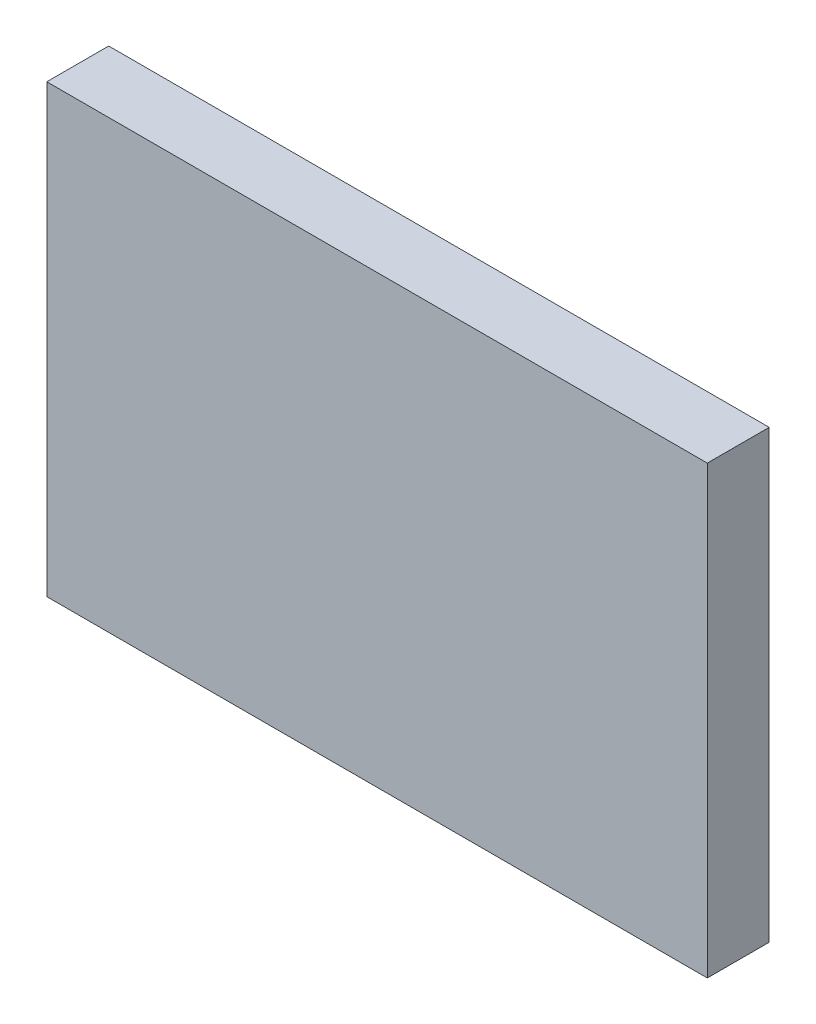
ISO-10303-21;
HEADER;
FILE_DESCRIPTION(('STEP AP214'),'2;1');
FILE_NAME('part.step','',(''),(''),'','','');
FILE_SCHEMA(('AUTOMOTIVE_DESIGN { 1 0 10303 214 1 1 1 1 }'));
ENDSEC;
DATA;
#1=APPLICATION_CONTEXT('core data for automotive mechanical design processes');
#2=APPLICATION_PROTOCOL_DEFINITION('international standard','automotive_design',2000,#1);
#3=PRODUCT_CONTEXT('',#1,'mechanical');
#4=PRODUCT('Part','Part','',(#3));
#5=PRODUCT_RELATED_PRODUCT_CATEGORY('part','',(#4));
#6=PRODUCT_DEFINITION_FORMATION('','',#4);
#7=PRODUCT_DEFINITION_CONTEXT('part definition',#1,'design');
#8=PRODUCT_DEFINITION('design','',#6,#7);
#9=PRODUCT_DEFINITION_SHAPE('','',#8);
#10=(LENGTH_UNIT() NAMED_UNIT(*) SI_UNIT(.MILLI.,.METRE.));
#11=(NAMED_UNIT(*) PLANE_ANGLE_UNIT() SI_UNIT($,.RADIAN.));
#12=(NAMED_UNIT(*) SI_UNIT($,.STERADIAN.) SOLID_ANGLE_UNIT());
#13=UNCERTAINTY_MEASURE_WITH_UNIT(LENGTH_MEASURE(1.E-05),#10,'distance_accuracy_value','');
#14=(GEOMETRIC_REPRESENTATION_CONTEXT(3) GLOBAL_UNCERTAINTY_ASSIGNED_CONTEXT((#13)) GLOBAL_UNIT_ASSIGNED_CONTEXT((#10,
#11,#12)) REPRESENTATION_CONTEXT('',''));
#15=CARTESIAN_POINT('',(0.,0.,0.));
#16=DIRECTION('',(0.,0.,1.));
#17=DIRECTION('',(1.,0.,0.));
#18=AXIS2_PLACEMENT_3D('',#15,#16,#17);
#19=CARTESIAN_POINT('',(0.,-30.7,5.));
#20=DIRECTION('',(0.,1.,0.));
#21=DIRECTION('',(0.,0.,1.));
#22=AXIS2_PLACEMENT_3D('',#19,#20,#21);
#23=PLANE('',#22);
#24=DIRECTION('',(0.,0.,-1.));
#25=VECTOR('',#24,1.);
#26=CARTESIAN_POINT('',(-37.65,-30.7,7.));
#27=LINE('',#26,#25);
#28=CARTESIAN_POINT('',(-37.65,-30.7,5.));
#29=VERTEX_POINT('',#28);
#30=CARTESIAN_POINT('',(-37.65,-30.7,0.));
#31=VERTEX_POINT('',#30);
#32=EDGE_CURVE('E270',#29,#31,#27,.T.);
#33=ORIENTED_EDGE('',*,*,#32,.F.);
#34=DIRECTION('',(1.,0.,0.));
#35=VECTOR('',#34,1.);
#36=CARTESIAN_POINT('',(0.,-30.7,5.));
#37=LINE('',#36,#35);
#38=CARTESIAN_POINT('',(-17.95,-30.7,5.));
#39=VERTEX_POINT('',#38);
#40=EDGE_CURVE('E374',#29,#39,#37,.T.);
#41=ORIENTED_EDGE('',*,*,#40,.T.);
#42=DIRECTION('',(0.,0.,1.));
#43=VECTOR('',#42,1.);
#44=CARTESIAN_POINT('',(-17.95,-30.7,5.));
#45=LINE('',#44,#43);
#46=CARTESIAN_POINT('',(-17.95,-30.7,0.));
#47=VERTEX_POINT('',#46);
#48=EDGE_CURVE('E337',#47,#39,#45,.T.);
#49=ORIENTED_EDGE('',*,*,#48,.F.);
#50=DIRECTION('',(1.,0.,0.));
#51=VECTOR('',#50,1.);
#52=CARTESIAN_POINT('',(0.,-30.7,0.));
#53=LINE('',#52,#51);
#54=EDGE_CURVE('E422',#31,#47,#53,.T.);
#55=ORIENTED_EDGE('',*,*,#54,.F.);
#56=EDGE_LOOP('',(#33,#41,#49,#55));
#57=FACE_BOUND('',#56,.T.);
#58=ADVANCED_FACE('F40',(#57),#23,.T.);
#59=CARTESIAN_POINT('',(0.,0.,5.));
#60=DIRECTION('',(0.,0.,1.));
#61=DIRECTION('',(1.,0.,0.));
#62=AXIS2_PLACEMENT_3D('',#59,#60,#61);
#63=PLANE('',#62);
#64=ORIENTED_EDGE('',*,*,#40,.F.);
#65=DIRECTION('',(0.,1.,0.));
#66=VECTOR('',#65,1.);
#67=CARTESIAN_POINT('',(-37.65,0.,5.));
#68=LINE('',#67,#66);
#69=CARTESIAN_POINT('',(-37.65,-28.2,5.));
#70=VERTEX_POINT('',#69);
#71=EDGE_CURVE('E284',#29,#70,#68,.T.);
#72=ORIENTED_EDGE('',*,*,#71,.T.);
#73=DIRECTION('',(-1.,0.,0.));
#74=VECTOR('',#73,1.);
#75=CARTESIAN_POINT('',(0.,-28.2,5.));
#76=LINE('',#75,#74);
#77=CARTESIAN_POINT('',(-43.45,-28.2,5.));
#78=VERTEX_POINT('',#77);
#79=EDGE_CURVE('E274',#70,#78,#76,.T.);
#80=ORIENTED_EDGE('',*,*,#79,.T.);
#81=DIRECTION('',(0.,-1.,0.));
#82=VECTOR('',#81,1.);
#83=CARTESIAN_POINT('',(-43.45,0.,5.));
#84=LINE('',#83,#82);
#85=CARTESIAN_POINT('',(-43.45,24.,5.));
#86=VERTEX_POINT('',#85);
#87=EDGE_CURVE('E377',#86,#78,#84,.T.);
#88=ORIENTED_EDGE('',*,*,#87,.F.);
#89=DIRECTION('',(-1.,0.,0.));
#90=VECTOR('',#89,1.);
#91=CARTESIAN_POINT('',(0.,24.,5.));
#92=LINE('',#91,#90);
#93=CARTESIAN_POINT('',(-40.25,24.,5.));
#94=VERTEX_POINT('',#93);
#95=EDGE_CURVE('E381',#94,#86,#92,.T.);
#96=ORIENTED_EDGE('',*,*,#95,.F.);
#97=DIRECTION('',(0.,1.,0.));
#98=VECTOR('',#97,1.);
#99=CARTESIAN_POINT('',(-40.25,0.,5.));
#100=LINE('',#99,#98);
#101=CARTESIAN_POINT('',(-40.25,-24.,5.));
#102=VERTEX_POINT('',#101);
#103=EDGE_CURVE('E385',#102,#94,#100,.T.);
#104=ORIENTED_EDGE('',*,*,#103,.F.);
#105=DIRECTION('',(-1.,0.,0.));
#106=VECTOR('',#105,1.);
#107=CARTESIAN_POINT('',(0.,-24.,5.));
#108=LINE('',#107,#106);
#109=CARTESIAN_POINT('',(-17.95,-24.,5.));
#110=VERTEX_POINT('',#109);
#111=EDGE_CURVE('E389',#110,#102,#108,.T.);
#112=ORIENTED_EDGE('',*,*,#111,.F.);
#113=DIRECTION('',(0.,-1.,0.));
#114=VECTOR('',#113,1.);
#115=CARTESIAN_POINT('',(-17.95,0.,5.));
#116=LINE('',#115,#114);
#117=EDGE_CURVE('E476',#110,#39,#116,.T.);
#118=ORIENTED_EDGE('',*,*,#117,.T.);
#119=EDGE_LOOP('',(#64,#72,#80,#88,#96,#104,#112,#118));
#120=FACE_BOUND('',#119,.T.);
#121=ADVANCED_FACE('F530',(#120),#63,.F.);
#122=CARTESIAN_POINT('',(40.25,0.,5.));
#123=DIRECTION('',(-1.,0.,0.));
#124=DIRECTION('',(0.,-1.,0.));
#125=AXIS2_PLACEMENT_3D('',#122,#123,#124);
#126=PLANE('',#125);
#127=DIRECTION('',(0.,1.,0.));
#128=VECTOR('',#127,1.);
#129=CARTESIAN_POINT('',(40.25,0.,0.));
#130=LINE('',#129,#128);
#131=CARTESIAN_POINT('',(40.25,-24.,0.));
#132=VERTEX_POINT('',#131);
#133=CARTESIAN_POINT('',(40.25,24.,0.));
#134=VERTEX_POINT('',#133);
#135=EDGE_CURVE('E410',#132,#134,#130,.T.);
#136=ORIENTED_EDGE('',*,*,#135,.T.);
#137=DIRECTION('',(0.,0.,-1.));
#138=VECTOR('',#137,1.);
#139=CARTESIAN_POINT('',(40.25,24.,5.));
#140=LINE('',#139,#138);
#141=CARTESIAN_POINT('',(40.25,24.,5.));
#142=VERTEX_POINT('',#141);
#143=EDGE_CURVE('E457',#142,#134,#140,.T.);
#144=ORIENTED_EDGE('',*,*,#143,.F.);
#145=DIRECTION('',(0.,1.,0.));
#146=VECTOR('',#145,1.);
#147=CARTESIAN_POINT('',(40.25,0.,5.));
#148=LINE('',#147,#146);
#149=CARTESIAN_POINT('',(40.25,-24.,5.));
#150=VERTEX_POINT('',#149);
#151=EDGE_CURVE('E362',#150,#142,#148,.T.);
#152=ORIENTED_EDGE('',*,*,#151,.F.);
#153=DIRECTION('',(0.,0.,-1.));
#154=VECTOR('',#153,1.);
#155=CARTESIAN_POINT('',(40.25,-24.,5.));
#156=LINE('',#155,#154);
#157=EDGE_CURVE('E439',#150,#132,#156,.T.);
#158=ORIENTED_EDGE('',*,*,#157,.T.);
#159=EDGE_LOOP('',(#136,#144,#152,#158));
#160=FACE_BOUND('',#159,.T.);
#161=ADVANCED_FACE('F592',(#160),#126,.F.);
#162=CARTESIAN_POINT('',(0.,24.0000000000001,5.));
#163=DIRECTION('',(0.,-1.,0.));
#164=DIRECTION('',(1.,0.,0.));
#165=AXIS2_PLACEMENT_3D('',#162,#163,#164);
#166=PLANE('',#165);
#167=DIRECTION('',(-1.,0.,0.));
#168=VECTOR('',#167,1.);
#169=CARTESIAN_POINT('',(0.,24.0000000000001,0.));
#170=LINE('',#169,#168);
#171=CARTESIAN_POINT('',(43.45,24.,0.));
#172=VERTEX_POINT('',#171);
#173=EDGE_CURVE('E414',#172,#134,#170,.T.);
#174=ORIENTED_EDGE('',*,*,#173,.F.);
#175=DIRECTION('',(0.,0.,-1.));
#176=VECTOR('',#175,1.);
#177=CARTESIAN_POINT('',(43.45,24.,5.));
#178=LINE('',#177,#176);
#179=CARTESIAN_POINT('',(43.45,24.,5.));
#180=VERTEX_POINT('',#179);
#181=EDGE_CURVE('E453',#180,#172,#178,.T.);
#182=ORIENTED_EDGE('',*,*,#181,.F.);
#183=DIRECTION('',(-1.,0.,0.));
#184=VECTOR('',#183,1.);
#185=CARTESIAN_POINT('',(0.,24.0000000000001,5.));
#186=LINE('',#185,#184);
#187=EDGE_CURVE('E365',#180,#142,#186,.T.);
#188=ORIENTED_EDGE('',*,*,#187,.T.);
#189=ORIENTED_EDGE('',*,*,#143,.T.);
#190=EDGE_LOOP('',(#174,#182,#188,#189));
#191=FACE_BOUND('',#190,.T.);
#192=ADVANCED_FACE('F555',(#191),#166,.T.);
#193=CARTESIAN_POINT('',(43.45,0.,5.));
#194=DIRECTION('',(-1.,0.,0.));
#195=DIRECTION('',(0.,0.,1.));
#196=AXIS2_PLACEMENT_3D('',#193,#194,#195);
#197=PLANE('',#196);
#198=DIRECTION('',(0.,0.,-1.));
#199=VECTOR('',#198,1.);
#200=CARTESIAN_POINT('',(43.45,-28.2,7.));
#201=LINE('',#200,#199);
#202=CARTESIAN_POINT('',(43.45,-28.2,5.));
#203=VERTEX_POINT('',#202);
#204=CARTESIAN_POINT('',(43.45,-28.2,0.));
#205=VERTEX_POINT('',#204);
#206=EDGE_CURVE('E297',#203,#205,#201,.T.);
#207=ORIENTED_EDGE('',*,*,#206,.F.);
#208=DIRECTION('',(0.,1.,0.));
#209=VECTOR('',#208,1.);
#210=CARTESIAN_POINT('',(43.45,0.,5.));
#211=LINE('',#210,#209);
#212=EDGE_CURVE('E370',#203,#180,#211,.T.);
#213=ORIENTED_EDGE('',*,*,#212,.T.);
#214=ORIENTED_EDGE('',*,*,#181,.T.);
#215=DIRECTION('',(0.,1.,0.));
#216=VECTOR('',#215,1.);
#217=CARTESIAN_POINT('',(43.45,0.,0.));
#218=LINE('',#217,#216);
#219=EDGE_CURVE('E418',#205,#172,#218,.T.);
#220=ORIENTED_EDGE('',*,*,#219,.F.);
#221=EDGE_LOOP('',(#207,#213,#214,#220));
#222=FACE_BOUND('',#221,.T.);
#223=ADVANCED_FACE('F548',(#222),#197,.T.);
#224=DIRECTION('',(0.,0.,-1.));
#225=VECTOR('',#224,1.);
#226=CARTESIAN_POINT('',(40.75,-30.7,7.));
#227=LINE('',#226,#225);
#228=CARTESIAN_POINT('',(40.75,-30.7,5.));
#229=VERTEX_POINT('',#228);
#230=CARTESIAN_POINT('',(40.75,-30.7,0.));
#231=VERTEX_POINT('',#230);
#232=EDGE_CURVE('E296',#229,#231,#227,.T.);
#233=ORIENTED_EDGE('',*,*,#232,.T.);
#234=CARTESIAN_POINT('',(-7.95000000000001,-30.7,0.));
#235=VERTEX_POINT('',#234);
#236=EDGE_CURVE('E421',#235,#231,#53,.T.);
#237=ORIENTED_EDGE('',*,*,#236,.F.);
#238=DIRECTION('',(0.,0.,-1.));
#239=VECTOR('',#238,1.);
#240=CARTESIAN_POINT('',(-7.95000000000001,-30.7,5.));
#241=LINE('',#240,#239);
#242=CARTESIAN_POINT('',(-7.95000000000001,-30.7,5.));
#243=VERTEX_POINT('',#242);
#244=EDGE_CURVE('E328',#243,#235,#241,.T.);
#245=ORIENTED_EDGE('',*,*,#244,.F.);
#246=EDGE_CURVE('E373',#243,#229,#37,.T.);
#247=ORIENTED_EDGE('',*,*,#246,.T.);
#248=EDGE_LOOP('',(#233,#237,#245,#247));
#249=FACE_BOUND('',#248,.T.);
#250=ADVANCED_FACE('F494',(#249),#23,.T.);
#251=CARTESIAN_POINT('',(-43.45,0.,5.));
#252=DIRECTION('',(1.,0.,0.));
#253=DIRECTION('',(0.,0.,-1.));
#254=AXIS2_PLACEMENT_3D('',#251,#252,#253);
#255=PLANE('',#254);
#256=DIRECTION('',(0.,0.,-1.));
#257=VECTOR('',#256,1.);
#258=CARTESIAN_POINT('',(-43.45,-28.2,7.));
#259=LINE('',#258,#257);
#260=CARTESIAN_POINT('',(-43.45,-28.2,0.));
#261=VERTEX_POINT('',#260);
#262=EDGE_CURVE('E275',#78,#261,#259,.T.);
#263=ORIENTED_EDGE('',*,*,#262,.T.);
#264=DIRECTION('',(0.,-1.,0.));
#265=VECTOR('',#264,1.);
#266=CARTESIAN_POINT('',(-43.45,0.,0.));
#267=LINE('',#266,#265);
#268=CARTESIAN_POINT('',(-43.45,24.,0.));
#269=VERTEX_POINT('',#268);
#270=EDGE_CURVE('E425',#269,#261,#267,.T.);
#271=ORIENTED_EDGE('',*,*,#270,.F.);
#272=DIRECTION('',(0.,0.,-1.));
#273=VECTOR('',#272,1.);
#274=CARTESIAN_POINT('',(-43.45,24.,5.));
#275=LINE('',#274,#273);
#276=EDGE_CURVE('E450',#86,#269,#275,.T.);
#277=ORIENTED_EDGE('',*,*,#276,.F.);
#278=ORIENTED_EDGE('',*,*,#87,.T.);
#279=EDGE_LOOP('',(#263,#271,#277,#278));
#280=FACE_BOUND('',#279,.T.);
#281=ADVANCED_FACE('F571',(#280),#255,.T.);
#282=CARTESIAN_POINT('',(0.,24.,5.));
#283=DIRECTION('',(0.,-1.,0.));
#284=DIRECTION('',(0.,0.,-1.));
#285=AXIS2_PLACEMENT_3D('',#282,#283,#284);
#286=PLANE('',#285);
#287=DIRECTION('',(-1.,0.,0.));
#288=VECTOR('',#287,1.);
#289=CARTESIAN_POINT('',(0.,24.,0.));
#290=LINE('',#289,#288);
#291=CARTESIAN_POINT('',(-40.25,24.,0.));
#292=VERTEX_POINT('',#291);
#293=EDGE_CURVE('E429',#292,#269,#290,.T.);
#294=ORIENTED_EDGE('',*,*,#293,.F.);
#295=DIRECTION('',(0.,0.,-1.));
#296=VECTOR('',#295,1.);
#297=CARTESIAN_POINT('',(-40.25,24.,5.));
#298=LINE('',#297,#296);
#299=EDGE_CURVE('E447',#94,#292,#298,.T.);
#300=ORIENTED_EDGE('',*,*,#299,.F.);
#301=ORIENTED_EDGE('',*,*,#95,.T.);
#302=ORIENTED_EDGE('',*,*,#276,.T.);
#303=EDGE_LOOP('',(#294,#300,#301,#302));
#304=FACE_BOUND('',#303,.T.);
#305=ADVANCED_FACE('F568',(#304),#286,.T.);
#306=CARTESIAN_POINT('',(-40.25,0.,5.));
#307=DIRECTION('',(-1.,0.,0.));
#308=DIRECTION('',(0.,-1.,0.));
#309=AXIS2_PLACEMENT_3D('',#306,#307,#308);
#310=PLANE('',#309);
#311=DIRECTION('',(0.,1.,0.));
#312=VECTOR('',#311,1.);
#313=CARTESIAN_POINT('',(-40.25,0.,0.));
#314=LINE('',#313,#312);
#315=CARTESIAN_POINT('',(-40.25,-24.,0.));
#316=VERTEX_POINT('',#315);
#317=EDGE_CURVE('E433',#316,#292,#314,.T.);
#318=ORIENTED_EDGE('',*,*,#317,.F.);
#319=DIRECTION('',(0.,0.,-1.));
#320=VECTOR('',#319,1.);
#321=CARTESIAN_POINT('',(-40.25,-24.,5.));
#322=LINE('',#321,#320);
#323=EDGE_CURVE('E442',#102,#316,#322,.T.);
#324=ORIENTED_EDGE('',*,*,#323,.F.);
#325=ORIENTED_EDGE('',*,*,#103,.T.);
#326=ORIENTED_EDGE('',*,*,#299,.T.);
#327=EDGE_LOOP('',(#318,#324,#325,#326));
#328=FACE_BOUND('',#327,.T.);
#329=ADVANCED_FACE('F563',(#328),#310,.T.);
#330=CARTESIAN_POINT('',(0.,29.3,5.));
#331=DIRECTION('',(0.,1.,0.));
#332=DIRECTION('',(-1.,0.,0.));
#333=AXIS2_PLACEMENT_3D('',#330,#331,#332);
#334=PLANE('',#333);
#335=DIRECTION('',(1.,0.,0.));
#336=VECTOR('',#335,1.);
#337=CARTESIAN_POINT('',(0.,29.3,0.));
#338=LINE('',#337,#336);
#339=CARTESIAN_POINT('',(-48.,29.3,0.));
#340=VERTEX_POINT('',#339);
#341=CARTESIAN_POINT('',(48.,29.3,0.));
#342=VERTEX_POINT('',#341);
#343=EDGE_CURVE('E361',#340,#342,#338,.T.);
#344=ORIENTED_EDGE('',*,*,#343,.F.);
#345=DIRECTION('',(0.,0.,-1.));
#346=VECTOR('',#345,1.);
#347=CARTESIAN_POINT('',(-48.,29.3,5.));
#348=LINE('',#347,#346);
#349=CARTESIAN_POINT('',(-48.,29.3,9.));
#350=VERTEX_POINT('',#349);
#351=EDGE_CURVE('E443',#350,#340,#348,.T.);
#352=ORIENTED_EDGE('',*,*,#351,.F.);
#353=DIRECTION('',(-1.,0.,0.));
#354=VECTOR('',#353,1.);
#355=CARTESIAN_POINT('',(-48.,29.3,9.));
#356=LINE('',#355,#354);
#357=CARTESIAN_POINT('',(48.,29.3,9.));
#358=VERTEX_POINT('',#357);
#359=EDGE_CURVE('E357',#358,#350,#356,.T.);
#360=ORIENTED_EDGE('',*,*,#359,.F.);
#361=DIRECTION('',(0.,0.,-1.));
#362=VECTOR('',#361,1.);
#363=CARTESIAN_POINT('',(48.,29.3,5.));
#364=LINE('',#363,#362);
#365=EDGE_CURVE('E394',#358,#342,#364,.T.);
#366=ORIENTED_EDGE('',*,*,#365,.T.);
#367=EDGE_LOOP('',(#344,#352,#360,#366));
#368=FACE_BOUND('',#367,.T.);
#369=ADVANCED_FACE('F42',(#368),#334,.T.);
#370=CARTESIAN_POINT('',(-48.,0.,5.));
#371=DIRECTION('',(1.,0.,0.));
#372=DIRECTION('',(0.,1.,0.));
#373=AXIS2_PLACEMENT_3D('',#370,#371,#372);
#374=PLANE('',#373);
#375=DIRECTION('',(0.,-1.,0.));
#376=VECTOR('',#375,1.);
#377=CARTESIAN_POINT('',(-48.,0.,0.));
#378=LINE('',#377,#376);
#379=CARTESIAN_POINT('',(-48.,-35.5116047322781,0.));
#380=VERTEX_POINT('',#379);
#381=EDGE_CURVE('E398',#340,#380,#378,.T.);
#382=ORIENTED_EDGE('',*,*,#381,.T.);
#383=DIRECTION('',(0.,0.,-1.));
#384=VECTOR('',#383,1.);
#385=CARTESIAN_POINT('',(-48.,-35.5116047322781,5.));
#386=LINE('',#385,#384);
#387=CARTESIAN_POINT('',(-48.,-35.5116047322781,9.));
#388=VERTEX_POINT('',#387);
#389=EDGE_CURVE('E467',#388,#380,#386,.T.);
#390=ORIENTED_EDGE('',*,*,#389,.F.);
#391=DIRECTION('',(0.,-1.,0.));
#392=VECTOR('',#391,1.);
#393=CARTESIAN_POINT('',(-48.,29.3,9.));
#394=LINE('',#393,#392);
#395=EDGE_CURVE('E345',#350,#388,#394,.T.);
#396=ORIENTED_EDGE('',*,*,#395,.F.);
#397=ORIENTED_EDGE('',*,*,#351,.T.);
#398=EDGE_LOOP('',(#382,#390,#396,#397));
#399=FACE_BOUND('',#398,.T.);
#400=ADVANCED_FACE('F611',(#399),#374,.F.);
#401=CARTESIAN_POINT('',(0.,-35.5116047322781,5.));
#402=DIRECTION('',(0.,1.,0.));
#403=DIRECTION('',(-1.,0.,0.));
#404=AXIS2_PLACEMENT_3D('',#401,#402,#403);
#405=PLANE('',#404);
#406=DIRECTION('',(1.,0.,0.));
#407=VECTOR('',#406,1.);
#408=CARTESIAN_POINT('',(0.,-35.5116047322781,0.));
#409=LINE('',#408,#407);
#410=CARTESIAN_POINT('',(-17.95,-35.5116047322781,0.));
#411=VERTEX_POINT('',#410);
#412=EDGE_CURVE('E402',#380,#411,#409,.T.);
#413=ORIENTED_EDGE('',*,*,#412,.T.);
#414=DIRECTION('',(0.,0.,1.));
#415=VECTOR('',#414,1.);
#416=CARTESIAN_POINT('',(-17.95,-35.5116047322781,5.));
#417=LINE('',#416,#415);
#418=CARTESIAN_POINT('',(-17.95,-35.5116047322781,6.8));
#419=VERTEX_POINT('',#418);
#420=EDGE_CURVE('E341',#411,#419,#417,.T.);
#421=ORIENTED_EDGE('',*,*,#420,.T.);
#422=DIRECTION('',(1.,0.,0.));
#423=VECTOR('',#422,1.);
#424=CARTESIAN_POINT('',(0.,-35.5116047322781,6.8));
#425=LINE('',#424,#423);
#426=CARTESIAN_POINT('',(-7.95000000000001,-35.5116047322781,6.8));
#427=VERTEX_POINT('',#426);
#428=EDGE_CURVE('E480',#419,#427,#425,.T.);
#429=ORIENTED_EDGE('',*,*,#428,.T.);
#430=DIRECTION('',(0.,0.,-1.));
#431=VECTOR('',#430,1.);
#432=CARTESIAN_POINT('',(-7.95000000000001,-35.5116047322781,5.));
#433=LINE('',#432,#431);
#434=CARTESIAN_POINT('',(-7.95000000000001,-35.5116047322781,0.));
#435=VERTEX_POINT('',#434);
#436=EDGE_CURVE('E333',#427,#435,#433,.T.);
#437=ORIENTED_EDGE('',*,*,#436,.T.);
#438=CARTESIAN_POINT('',(48.,-35.5116047322781,0.));
#439=VERTEX_POINT('',#438);
#440=EDGE_CURVE('E401',#435,#439,#409,.T.);
#441=ORIENTED_EDGE('',*,*,#440,.T.);
#442=DIRECTION('',(0.,0.,-1.));
#443=VECTOR('',#442,1.);
#444=CARTESIAN_POINT('',(48.,-35.5116047322781,5.));
#445=LINE('',#444,#443);
#446=CARTESIAN_POINT('',(48.,-35.5116047322781,9.));
#447=VERTEX_POINT('',#446);
#448=EDGE_CURVE('E463',#447,#439,#445,.T.);
#449=ORIENTED_EDGE('',*,*,#448,.F.);
#450=DIRECTION('',(1.,0.,0.));
#451=VECTOR('',#450,1.);
#452=CARTESIAN_POINT('',(-48.,-35.5116047322781,9.));
#453=LINE('',#452,#451);
#454=EDGE_CURVE('E349',#388,#447,#453,.T.);
#455=ORIENTED_EDGE('',*,*,#454,.F.);
#456=ORIENTED_EDGE('',*,*,#389,.T.);
#457=EDGE_LOOP('',(#413,#421,#429,#437,#441,#449,#455,#456));
#458=FACE_BOUND('',#457,.T.);
#459=ADVANCED_FACE('F502',(#458),#405,.F.);
#460=CARTESIAN_POINT('',(48.,0.,5.));
#461=DIRECTION('',(1.,0.,0.));
#462=DIRECTION('',(0.,0.,-1.));
#463=AXIS2_PLACEMENT_3D('',#460,#461,#462);
#464=PLANE('',#463);
#465=DIRECTION('',(0.,-1.,0.));
#466=VECTOR('',#465,1.);
#467=CARTESIAN_POINT('',(48.,0.,0.));
#468=LINE('',#467,#466);
#469=EDGE_CURVE('E406',#342,#439,#468,.T.);
#470=ORIENTED_EDGE('',*,*,#469,.F.);
#471=ORIENTED_EDGE('',*,*,#365,.F.);
#472=DIRECTION('',(0.,1.,0.));
#473=VECTOR('',#472,1.);
#474=CARTESIAN_POINT('',(48.,29.3,9.));
#475=LINE('',#474,#473);
#476=EDGE_CURVE('E353',#447,#358,#475,.T.);
#477=ORIENTED_EDGE('',*,*,#476,.F.);
#478=ORIENTED_EDGE('',*,*,#448,.T.);
#479=EDGE_LOOP('',(#470,#471,#477,#478));
#480=FACE_BOUND('',#479,.T.);
#481=ADVANCED_FACE('F508',(#480),#464,.T.);
#482=CARTESIAN_POINT('',(0.,-24.,5.));
#483=DIRECTION('',(0.,-1.,0.));
#484=DIRECTION('',(0.,0.,-1.));
#485=AXIS2_PLACEMENT_3D('',#482,#483,#484);
#486=PLANE('',#485);
#487=CARTESIAN_POINT('',(-7.95000000000001,-24.,5.));
#488=VERTEX_POINT('',#487);
#489=EDGE_CURVE('E390',#150,#488,#108,.T.);
#490=ORIENTED_EDGE('',*,*,#489,.T.);
#491=DIRECTION('',(0.,0.,-1.));
#492=VECTOR('',#491,1.);
#493=CARTESIAN_POINT('',(-7.95000000000001,-24.,6.8));
#494=LINE('',#493,#492);
#495=CARTESIAN_POINT('',(-7.95000000000001,-24.,6.8));
#496=VERTEX_POINT('',#495);
#497=EDGE_CURVE('E325',#496,#488,#494,.T.);
#498=ORIENTED_EDGE('',*,*,#497,.F.);
#499=DIRECTION('',(1.,0.,0.));
#500=VECTOR('',#499,1.);
#501=CARTESIAN_POINT('',(-17.95,-24.,6.8));
#502=LINE('',#501,#500);
#503=CARTESIAN_POINT('',(-17.95,-24.,6.8));
#504=VERTEX_POINT('',#503);
#505=EDGE_CURVE('E310',#504,#496,#502,.T.);
#506=ORIENTED_EDGE('',*,*,#505,.F.);
#507=DIRECTION('',(0.,0.,-1.));
#508=VECTOR('',#507,1.);
#509=CARTESIAN_POINT('',(-17.95,-24.,6.8));
#510=LINE('',#509,#508);
#511=EDGE_CURVE('E319',#504,#110,#510,.T.);
#512=ORIENTED_EDGE('',*,*,#511,.T.);
#513=ORIENTED_EDGE('',*,*,#111,.T.);
#514=ORIENTED_EDGE('',*,*,#323,.T.);
#515=DIRECTION('',(-1.,0.,0.));
#516=VECTOR('',#515,1.);
#517=CARTESIAN_POINT('',(0.,-24.,0.));
#518=LINE('',#517,#516);
#519=EDGE_CURVE('E366',#132,#316,#518,.T.);
#520=ORIENTED_EDGE('',*,*,#519,.F.);
#521=ORIENTED_EDGE('',*,*,#157,.F.);
#522=EDGE_LOOP('',(#490,#498,#506,#512,#513,#514,#520,#521));
#523=FACE_BOUND('',#522,.T.);
#524=ADVANCED_FACE('F536',(#523),#486,.T.);
#525=CARTESIAN_POINT('',(0.,0.,0.));
#526=DIRECTION('',(0.,0.,1.));
#527=DIRECTION('',(1.,0.,0.));
#528=AXIS2_PLACEMENT_3D('',#525,#526,#527);
#529=PLANE('',#528);
#530=DIRECTION('',(1.,0.,0.));
#531=VECTOR('',#530,1.);
#532=CARTESIAN_POINT('',(35.,17.5,0.));
#533=LINE('',#532,#531);
#534=CARTESIAN_POINT('',(-35.,17.5,0.));
#535=VERTEX_POINT('',#534);
#536=CARTESIAN_POINT('',(35.,17.5,0.));
#537=VERTEX_POINT('',#536);
#538=EDGE_CURVE('E251',#535,#537,#533,.T.);
#539=ORIENTED_EDGE('',*,*,#538,.F.);
#540=DIRECTION('',(0.,1.,0.));
#541=VECTOR('',#540,1.);
#542=CARTESIAN_POINT('',(-35.,-17.5,0.));
#543=LINE('',#542,#541);
#544=CARTESIAN_POINT('',(-35.,-17.5,0.));
#545=VERTEX_POINT('',#544);
#546=EDGE_CURVE('E56',#545,#535,#543,.T.);
#547=ORIENTED_EDGE('',*,*,#546,.F.);
#548=DIRECTION('',(-1.,0.,0.));
#549=VECTOR('',#548,1.);
#550=CARTESIAN_POINT('',(35.,-17.5,0.));
#551=LINE('',#550,#549);
#552=CARTESIAN_POINT('',(35.,-17.5,0.));
#553=VERTEX_POINT('',#552);
#554=EDGE_CURVE('E238',#553,#545,#551,.T.);
#555=ORIENTED_EDGE('',*,*,#554,.F.);
#556=DIRECTION('',(0.,-1.,0.));
#557=VECTOR('',#556,1.);
#558=CARTESIAN_POINT('',(35.,-17.5,0.));
#559=LINE('',#558,#557);
#560=EDGE_CURVE('E242',#537,#553,#559,.T.);
#561=ORIENTED_EDGE('',*,*,#560,.F.);
#562=EDGE_LOOP('',(#539,#547,#555,#561));
#563=FACE_BOUND('',#562,.T.);
#564=ORIENTED_EDGE('',*,*,#270,.T.);
#565=DIRECTION('',(1.,0.,0.));
#566=VECTOR('',#565,1.);
#567=CARTESIAN_POINT('',(-43.45,-28.2,0.));
#568=LINE('',#567,#566);
#569=CARTESIAN_POINT('',(-37.65,-28.2,0.));
#570=VERTEX_POINT('',#569);
#571=EDGE_CURVE('E267',#261,#570,#568,.T.);
#572=ORIENTED_EDGE('',*,*,#571,.T.);
#573=DIRECTION('',(0.,-1.,0.));
#574=VECTOR('',#573,1.);
#575=CARTESIAN_POINT('',(-37.65,-30.7,0.));
#576=LINE('',#575,#574);
#577=EDGE_CURVE('E64',#570,#31,#576,.T.);
#578=ORIENTED_EDGE('',*,*,#577,.T.);
#579=ORIENTED_EDGE('',*,*,#54,.T.);
#580=DIRECTION('',(0.,1.,0.));
#581=VECTOR('',#580,1.);
#582=CARTESIAN_POINT('',(-17.95,-24.,0.));
#583=LINE('',#582,#581);
#584=EDGE_CURVE('E300',#411,#47,#583,.T.);
#585=ORIENTED_EDGE('',*,*,#584,.F.);
#586=ORIENTED_EDGE('',*,*,#412,.F.);
#587=ORIENTED_EDGE('',*,*,#381,.F.);
#588=ORIENTED_EDGE('',*,*,#343,.T.);
#589=ORIENTED_EDGE('',*,*,#469,.T.);
#590=ORIENTED_EDGE('',*,*,#440,.F.);
#591=DIRECTION('',(0.,-1.,0.));
#592=VECTOR('',#591,1.);
#593=CARTESIAN_POINT('',(-7.95000000000001,-24.,0.));
#594=LINE('',#593,#592);
#595=EDGE_CURVE('E311',#235,#435,#594,.T.);
#596=ORIENTED_EDGE('',*,*,#595,.F.);
#597=ORIENTED_EDGE('',*,*,#236,.T.);
#598=DIRECTION('',(0.,1.,0.));
#599=VECTOR('',#598,1.);
#600=CARTESIAN_POINT('',(40.75,-30.7,0.));
#601=LINE('',#600,#599);
#602=CARTESIAN_POINT('',(40.75,-28.2,0.));
#603=VERTEX_POINT('',#602);
#604=EDGE_CURVE('E288',#231,#603,#601,.T.);
#605=ORIENTED_EDGE('',*,*,#604,.T.);
#606=DIRECTION('',(1.,0.,0.));
#607=VECTOR('',#606,1.);
#608=CARTESIAN_POINT('',(43.45,-28.2,0.));
#609=LINE('',#608,#607);
#610=EDGE_CURVE('E292',#603,#205,#609,.T.);
#611=ORIENTED_EDGE('',*,*,#610,.T.);
#612=ORIENTED_EDGE('',*,*,#219,.T.);
#613=ORIENTED_EDGE('',*,*,#173,.T.);
#614=ORIENTED_EDGE('',*,*,#135,.F.);
#615=ORIENTED_EDGE('',*,*,#519,.T.);
#616=ORIENTED_EDGE('',*,*,#317,.T.);
#617=ORIENTED_EDGE('',*,*,#293,.T.);
#618=EDGE_LOOP('',(#564,#572,#578,#579,#585,#586,#587,#588,#589,#590,#596,#597,#605,#611,#612,
#613,#614,#615,#616,#617));
#619=FACE_BOUND('',#618,.T.);
#620=ADVANCED_FACE('F509',(#563,#619),#529,.F.);
#621=ORIENTED_EDGE('',*,*,#212,.F.);
#622=DIRECTION('',(-1.,0.,0.));
#623=VECTOR('',#622,1.);
#624=CARTESIAN_POINT('',(0.,-28.2,5.));
#625=LINE('',#624,#623);
#626=CARTESIAN_POINT('',(40.75,-28.2,5.));
#627=VERTEX_POINT('',#626);
#628=EDGE_CURVE('E11',#203,#627,#625,.T.);
#629=ORIENTED_EDGE('',*,*,#628,.T.);
#630=DIRECTION('',(0.,-1.,0.));
#631=VECTOR('',#630,1.);
#632=CARTESIAN_POINT('',(40.75,0.,5.));
#633=LINE('',#632,#631);
#634=EDGE_CURVE('E49',#627,#229,#633,.T.);
#635=ORIENTED_EDGE('',*,*,#634,.T.);
#636=ORIENTED_EDGE('',*,*,#246,.F.);
#637=DIRECTION('',(0.,1.,0.));
#638=VECTOR('',#637,1.);
#639=CARTESIAN_POINT('',(-7.95000000000001,0.,5.));
#640=LINE('',#639,#638);
#641=EDGE_CURVE('E460',#243,#488,#640,.T.);
#642=ORIENTED_EDGE('',*,*,#641,.T.);
#643=ORIENTED_EDGE('',*,*,#489,.F.);
#644=ORIENTED_EDGE('',*,*,#151,.T.);
#645=ORIENTED_EDGE('',*,*,#187,.F.);
#646=EDGE_LOOP('',(#621,#629,#635,#636,#642,#643,#644,#645));
#647=FACE_BOUND('',#646,.T.);
#648=ADVANCED_FACE('F489',(#647),#63,.F.);
#649=CARTESIAN_POINT('',(0.,0.,9.));
#650=DIRECTION('',(0.,0.,1.));
#651=DIRECTION('',(1.,0.,0.));
#652=AXIS2_PLACEMENT_3D('',#649,#650,#651);
#653=PLANE('',#652);
#654=ORIENTED_EDGE('',*,*,#395,.T.);
#655=ORIENTED_EDGE('',*,*,#454,.T.);
#656=ORIENTED_EDGE('',*,*,#476,.T.);
#657=ORIENTED_EDGE('',*,*,#359,.T.);
#658=EDGE_LOOP('',(#654,#655,#656,#657));
#659=FACE_BOUND('',#658,.T.);
#660=ADVANCED_FACE('F516',(#659),#653,.T.);
#661=CARTESIAN_POINT('',(0.,0.,6.8));
#662=DIRECTION('',(0.,0.,1.));
#663=DIRECTION('',(1.,0.,0.));
#664=AXIS2_PLACEMENT_3D('',#661,#662,#663);
#665=PLANE('',#664);
#666=DIRECTION('',(0.,1.,0.));
#667=VECTOR('',#666,1.);
#668=CARTESIAN_POINT('',(-17.95,-24.,6.8));
#669=LINE('',#668,#667);
#670=EDGE_CURVE('E307',#419,#504,#669,.T.);
#671=ORIENTED_EDGE('',*,*,#670,.T.);
#672=ORIENTED_EDGE('',*,*,#505,.T.);
#673=DIRECTION('',(0.,-1.,0.));
#674=VECTOR('',#673,1.);
#675=CARTESIAN_POINT('',(-7.95000000000001,-24.,6.8));
#676=LINE('',#675,#674);
#677=EDGE_CURVE('E315',#496,#427,#676,.T.);
#678=ORIENTED_EDGE('',*,*,#677,.T.);
#679=ORIENTED_EDGE('',*,*,#428,.F.);
#680=EDGE_LOOP('',(#671,#672,#678,#679));
#681=FACE_BOUND('',#680,.T.);
#682=ADVANCED_FACE('F539',(#681),#665,.F.);
#683=CARTESIAN_POINT('',(-17.95,-24.,6.8));
#684=DIRECTION('',(-1.,0.,0.));
#685=DIRECTION('',(0.,-1.,0.));
#686=AXIS2_PLACEMENT_3D('',#683,#684,#685);
#687=PLANE('',#686);
#688=ORIENTED_EDGE('',*,*,#584,.T.);
#689=ORIENTED_EDGE('',*,*,#48,.T.);
#690=ORIENTED_EDGE('',*,*,#117,.F.);
#691=ORIENTED_EDGE('',*,*,#511,.F.);
#692=ORIENTED_EDGE('',*,*,#670,.F.);
#693=ORIENTED_EDGE('',*,*,#420,.F.);
#694=EDGE_LOOP('',(#688,#689,#690,#691,#692,#693));
#695=FACE_BOUND('',#694,.T.);
#696=ADVANCED_FACE('F523',(#695),#687,.F.);
#697=CARTESIAN_POINT('',(-7.95000000000001,-24.,6.8));
#698=DIRECTION('',(1.,0.,0.));
#699=DIRECTION('',(0.,0.,-1.));
#700=AXIS2_PLACEMENT_3D('',#697,#698,#699);
#701=PLANE('',#700);
#702=ORIENTED_EDGE('',*,*,#677,.F.);
#703=ORIENTED_EDGE('',*,*,#497,.T.);
#704=ORIENTED_EDGE('',*,*,#641,.F.);
#705=ORIENTED_EDGE('',*,*,#244,.T.);
#706=ORIENTED_EDGE('',*,*,#595,.T.);
#707=ORIENTED_EDGE('',*,*,#436,.F.);
#708=EDGE_LOOP('',(#702,#703,#704,#705,#706,#707));
#709=FACE_BOUND('',#708,.T.);
#710=ADVANCED_FACE('F541',(#709),#701,.F.);
#711=CARTESIAN_POINT('',(43.45,-28.2,7.));
#712=DIRECTION('',(0.,1.,0.));
#713=DIRECTION('',(0.,0.,1.));
#714=AXIS2_PLACEMENT_3D('',#711,#712,#713);
#715=PLANE('',#714);
#716=ORIENTED_EDGE('',*,*,#628,.F.);
#717=ORIENTED_EDGE('',*,*,#206,.T.);
#718=ORIENTED_EDGE('',*,*,#610,.F.);
#719=DIRECTION('',(0.,0.,-1.));
#720=VECTOR('',#719,1.);
#721=CARTESIAN_POINT('',(40.75,-28.2,7.));
#722=LINE('',#721,#720);
#723=EDGE_CURVE('E301',#627,#603,#722,.T.);
#724=ORIENTED_EDGE('',*,*,#723,.F.);
#725=EDGE_LOOP('',(#716,#717,#718,#724));
#726=FACE_BOUND('',#725,.T.);
#727=ADVANCED_FACE('F545',(#726),#715,.T.);
#728=CARTESIAN_POINT('',(40.75,-30.7,7.));
#729=DIRECTION('',(-1.,0.,0.));
#730=DIRECTION('',(0.,0.,1.));
#731=AXIS2_PLACEMENT_3D('',#728,#729,#730);
#732=PLANE('',#731);
#733=ORIENTED_EDGE('',*,*,#634,.F.);
#734=ORIENTED_EDGE('',*,*,#723,.T.);
#735=ORIENTED_EDGE('',*,*,#604,.F.);
#736=ORIENTED_EDGE('',*,*,#232,.F.);
#737=EDGE_LOOP('',(#733,#734,#735,#736));
#738=FACE_BOUND('',#737,.T.);
#739=ADVANCED_FACE('F578',(#738),#732,.T.);
#740=CARTESIAN_POINT('',(-37.65,-30.7,7.));
#741=DIRECTION('',(1.,0.,0.));
#742=DIRECTION('',(0.,0.,-1.));
#743=AXIS2_PLACEMENT_3D('',#740,#741,#742);
#744=PLANE('',#743);
#745=ORIENTED_EDGE('',*,*,#71,.F.);
#746=ORIENTED_EDGE('',*,*,#32,.T.);
#747=ORIENTED_EDGE('',*,*,#577,.F.);
#748=DIRECTION('',(0.,0.,-1.));
#749=VECTOR('',#748,1.);
#750=CARTESIAN_POINT('',(-37.65,-28.2,7.));
#751=LINE('',#750,#749);
#752=EDGE_CURVE('E271',#70,#570,#751,.T.);
#753=ORIENTED_EDGE('',*,*,#752,.F.);
#754=EDGE_LOOP('',(#745,#746,#747,#753));
#755=FACE_BOUND('',#754,.T.);
#756=ADVANCED_FACE('F576',(#755),#744,.T.);
#757=CARTESIAN_POINT('',(-43.45,-28.2,7.));
#758=DIRECTION('',(0.,1.,0.));
#759=DIRECTION('',(0.,0.,1.));
#760=AXIS2_PLACEMENT_3D('',#757,#758,#759);
#761=PLANE('',#760);
#762=ORIENTED_EDGE('',*,*,#79,.F.);
#763=ORIENTED_EDGE('',*,*,#752,.T.);
#764=ORIENTED_EDGE('',*,*,#571,.F.);
#765=ORIENTED_EDGE('',*,*,#262,.F.);
#766=EDGE_LOOP('',(#762,#763,#764,#765));
#767=FACE_BOUND('',#766,.T.);
#768=ADVANCED_FACE('F573',(#767),#761,.T.);
#769=CARTESIAN_POINT('',(-35.,-17.5,5.));
#770=DIRECTION('',(-1.,0.,0.));
#771=DIRECTION('',(0.,0.,1.));
#772=AXIS2_PLACEMENT_3D('',#769,#770,#771);
#773=PLANE('',#772);
#774=ORIENTED_EDGE('',*,*,#546,.T.);
#775=DIRECTION('',(0.,0.,-1.));
#776=VECTOR('',#775,1.);
#777=CARTESIAN_POINT('',(-35.,17.5,5.));
#778=LINE('',#777,#776);
#779=CARTESIAN_POINT('',(-35.,17.5,5.));
#780=VERTEX_POINT('',#779);
#781=EDGE_CURVE('E213',#780,#535,#778,.T.);
#782=ORIENTED_EDGE('',*,*,#781,.F.);
#783=DIRECTION('',(0.,1.,0.));
#784=VECTOR('',#783,1.);
#785=CARTESIAN_POINT('',(-35.,-17.5,5.));
#786=LINE('',#785,#784);
#787=CARTESIAN_POINT('',(-35.,-17.5,5.));
#788=VERTEX_POINT('',#787);
#789=EDGE_CURVE('E217',#788,#780,#786,.T.);
#790=ORIENTED_EDGE('',*,*,#789,.F.);
#791=DIRECTION('',(0.,0.,-1.));
#792=VECTOR('',#791,1.);
#793=CARTESIAN_POINT('',(-35.,-17.5,5.));
#794=LINE('',#793,#792);
#795=EDGE_CURVE('E257',#788,#545,#794,.T.);
#796=ORIENTED_EDGE('',*,*,#795,.T.);
#797=EDGE_LOOP('',(#774,#782,#790,#796));
#798=FACE_BOUND('',#797,.T.);
#799=ADVANCED_FACE('F215',(#798),#773,.F.);
#800=CARTESIAN_POINT('',(35.,-17.5,5.));
#801=DIRECTION('',(0.,-1.,0.));
#802=DIRECTION('',(0.,0.,-1.));
#803=AXIS2_PLACEMENT_3D('',#800,#801,#802);
#804=PLANE('',#803);
#805=ORIENTED_EDGE('',*,*,#554,.T.);
#806=ORIENTED_EDGE('',*,*,#795,.F.);
#807=DIRECTION('',(-1.,0.,0.));
#808=VECTOR('',#807,1.);
#809=CARTESIAN_POINT('',(35.,-17.5,5.));
#810=LINE('',#809,#808);
#811=CARTESIAN_POINT('',(35.,-17.5,5.));
#812=VERTEX_POINT('',#811);
#813=EDGE_CURVE('E224',#812,#788,#810,.T.);
#814=ORIENTED_EDGE('',*,*,#813,.F.);
#815=DIRECTION('',(0.,0.,-1.));
#816=VECTOR('',#815,1.);
#817=CARTESIAN_POINT('',(35.,-17.5,5.));
#818=LINE('',#817,#816);
#819=EDGE_CURVE('E260',#812,#553,#818,.T.);
#820=ORIENTED_EDGE('',*,*,#819,.T.);
#821=EDGE_LOOP('',(#805,#806,#814,#820));
#822=FACE_BOUND('',#821,.T.);
#823=ADVANCED_FACE('F671',(#822),#804,.F.);
#824=CARTESIAN_POINT('',(35.,-17.5,5.));
#825=DIRECTION('',(1.,0.,0.));
#826=DIRECTION('',(0.,0.,-1.));
#827=AXIS2_PLACEMENT_3D('',#824,#825,#826);
#828=PLANE('',#827);
#829=ORIENTED_EDGE('',*,*,#560,.T.);
#830=ORIENTED_EDGE('',*,*,#819,.F.);
#831=DIRECTION('',(0.,-1.,0.));
#832=VECTOR('',#831,1.);
#833=CARTESIAN_POINT('',(35.,-17.5,5.));
#834=LINE('',#833,#832);
#835=CARTESIAN_POINT('',(35.,17.5,5.));
#836=VERTEX_POINT('',#835);
#837=EDGE_CURVE('E233',#836,#812,#834,.T.);
#838=ORIENTED_EDGE('',*,*,#837,.F.);
#839=DIRECTION('',(0.,0.,-1.));
#840=VECTOR('',#839,1.);
#841=CARTESIAN_POINT('',(35.,17.5,5.));
#842=LINE('',#841,#840);
#843=EDGE_CURVE('E223',#836,#537,#842,.T.);
#844=ORIENTED_EDGE('',*,*,#843,.T.);
#845=EDGE_LOOP('',(#829,#830,#838,#844));
#846=FACE_BOUND('',#845,.T.);
#847=ADVANCED_FACE('F680',(#846),#828,.F.);
#848=CARTESIAN_POINT('',(35.,17.5,5.));
#849=DIRECTION('',(0.,1.,0.));
#850=DIRECTION('',(0.,0.,1.));
#851=AXIS2_PLACEMENT_3D('',#848,#849,#850);
#852=PLANE('',#851);
#853=ORIENTED_EDGE('',*,*,#538,.T.);
#854=ORIENTED_EDGE('',*,*,#843,.F.);
#855=DIRECTION('',(1.,0.,0.));
#856=VECTOR('',#855,1.);
#857=CARTESIAN_POINT('',(35.,17.5,5.));
#858=LINE('',#857,#856);
#859=EDGE_CURVE('E227',#780,#836,#858,.T.);
#860=ORIENTED_EDGE('',*,*,#859,.F.);
#861=ORIENTED_EDGE('',*,*,#781,.T.);
#862=EDGE_LOOP('',(#853,#854,#860,#861));
#863=FACE_BOUND('',#862,.T.);
#864=ADVANCED_FACE('F228',(#863),#852,.F.);
#865=CARTESIAN_POINT('',(0.,0.,5.));
#866=DIRECTION('',(0.,0.,1.));
#867=DIRECTION('',(1.,0.,0.));
#868=AXIS2_PLACEMENT_3D('',#865,#866,#867);
#869=PLANE('',#868);
#870=ORIENTED_EDGE('',*,*,#789,.T.);
#871=ORIENTED_EDGE('',*,*,#859,.T.);
#872=ORIENTED_EDGE('',*,*,#837,.T.);
#873=ORIENTED_EDGE('',*,*,#813,.T.);
#874=EDGE_LOOP('',(#870,#871,#872,#873));
#875=FACE_BOUND('',#874,.T.);
#876=ADVANCED_FACE('F235',(#875),#869,.F.);
#877=CLOSED_SHELL('',(#58,#121,#161,#192,#223,#250,#281,#305,#329,#369,#400,#459,#481,#524,#620,
#648,#660,#682,#696,#710,#727,#739,#756,#768,#799,#823,#847,#864,#876));
#878=MANIFOLD_SOLID_BREP('B2',#877);
#879=ADVANCED_BREP_SHAPE_REPRESENTATION('',(#18,#878),#14);
#880=SHAPE_DEFINITION_REPRESENTATION(#9,#879);
ENDSEC;
END-ISO-10303-21;
